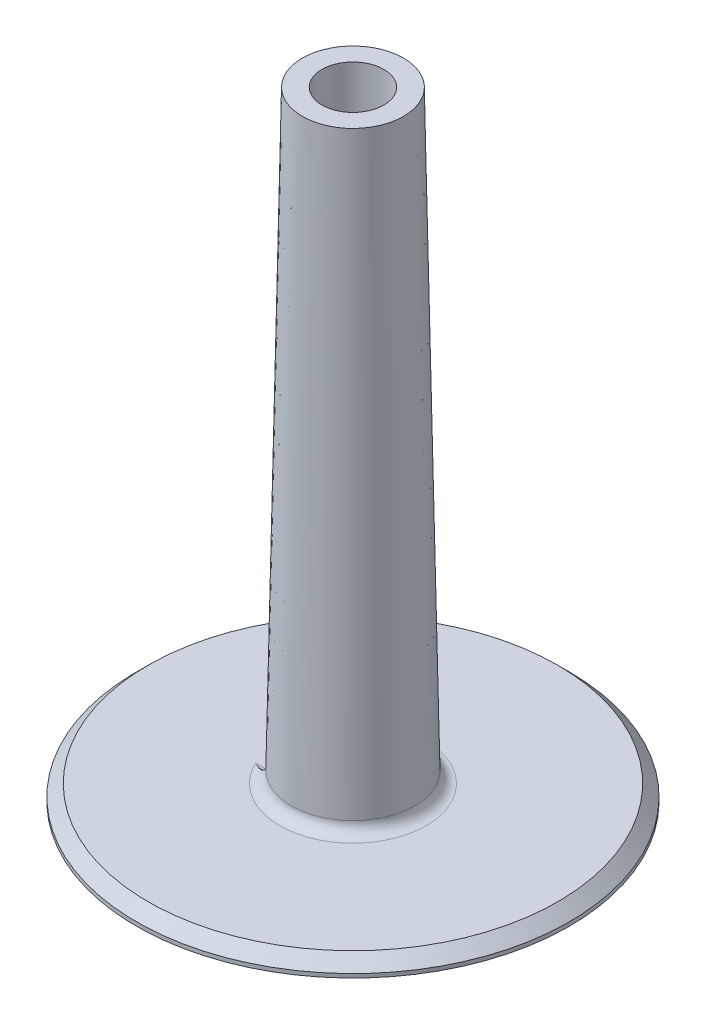
ISO-10303-21;
HEADER;
FILE_DESCRIPTION(('STEP AP214'),'2;1');
FILE_NAME('part.step','',(''),(''),'','','');
FILE_SCHEMA(('AUTOMOTIVE_DESIGN { 1 0 10303 214 1 1 1 1 }'));
ENDSEC;
DATA;
#1=APPLICATION_CONTEXT('core data for automotive mechanical design processes');
#2=APPLICATION_PROTOCOL_DEFINITION('international standard','automotive_design',2000,#1);
#3=PRODUCT_CONTEXT('',#1,'mechanical');
#4=PRODUCT('Part','Part','',(#3));
#5=PRODUCT_RELATED_PRODUCT_CATEGORY('part','',(#4));
#6=PRODUCT_DEFINITION_FORMATION('','',#4);
#7=PRODUCT_DEFINITION_CONTEXT('part definition',#1,'design');
#8=PRODUCT_DEFINITION('design','',#6,#7);
#9=PRODUCT_DEFINITION_SHAPE('','',#8);
#10=(LENGTH_UNIT() NAMED_UNIT(*) SI_UNIT(.MILLI.,.METRE.));
#11=(NAMED_UNIT(*) PLANE_ANGLE_UNIT() SI_UNIT($,.RADIAN.));
#12=(NAMED_UNIT(*) SI_UNIT($,.STERADIAN.) SOLID_ANGLE_UNIT());
#13=UNCERTAINTY_MEASURE_WITH_UNIT(LENGTH_MEASURE(1.E-05),#10,'distance_accuracy_value','');
#14=(GEOMETRIC_REPRESENTATION_CONTEXT(3) GLOBAL_UNCERTAINTY_ASSIGNED_CONTEXT((#13)) GLOBAL_UNIT_ASSIGNED_CONTEXT((#10,
#11,#12)) REPRESENTATION_CONTEXT('',''));
#15=CARTESIAN_POINT('',(0.,0.,0.));
#16=DIRECTION('',(0.,0.,1.));
#17=DIRECTION('',(1.,0.,0.));
#18=AXIS2_PLACEMENT_3D('',#15,#16,#17);
#19=CARTESIAN_POINT('',(0.,254.,0.));
#20=DIRECTION('',(0.,-1.,0.));
#21=DIRECTION('',(0.,0.,-1.));
#22=AXIS2_PLACEMENT_3D('',#19,#20,#21);
#23=CONICAL_SURFACE('',#22,7.9375,0.0187478031977445);
#24=CARTESIAN_POINT('',(0.,123.825,0.));
#25=DIRECTION('',(0.,-1.,0.));
#26=DIRECTION('',(0.,0.,-1.));
#27=AXIS2_PLACEMENT_3D('',#24,#25,#26);
#28=CIRCLE('',#27,10.37828125);
#29=CARTESIAN_POINT('',(0.,123.825,-10.37828125));
#30=VERTEX_POINT('',#29);
#31=EDGE_CURVE('E103',#30,#30,#28,.F.);
#32=ORIENTED_EDGE('',*,*,#31,.F.);
#33=EDGE_LOOP('',(#32));
#34=FACE_BOUND('',#33,.T.);
#35=CARTESIAN_POINT('',(-10.9986380954076,1.31233542988829E-08,6.3498));
#36=CARTESIAN_POINT('',(-10.9661542839363,1.8233393195671E-06,6.40607206991448));
#37=CARTESIAN_POINT('',(-10.9332096805369,0.00310269069035877,6.46201479725815));
#38=CARTESIAN_POINT('',(-10.8666748452448,0.0153468969863142,6.57284084258527));
#39=CARTESIAN_POINT('',(-10.8330846672008,0.0244897340620682,6.62772424817039));
#40=CARTESIAN_POINT('',(-10.7315971060793,0.0608037732642193,6.79044586185834));
#41=CARTESIAN_POINT('',(-10.6631335523318,0.0968591372913604,6.89609482020866));
#42=CARTESIAN_POINT('',(-10.5349289767664,0.18643584984036,7.08719809153657));
#43=CARTESIAN_POINT('',(-10.4750266462951,0.237726882466519,7.17360815162488));
#44=CARTESIAN_POINT('',(-10.3590417410145,0.357744114164864,7.33620002025002));
#45=CARTESIAN_POINT('',(-10.3029517020728,0.426434921148173,7.41240211697634));
#46=CARTESIAN_POINT('',(-10.2108354934768,0.56165114992968,7.53430871109204));
#47=CARTESIAN_POINT('',(-10.1732715971275,0.624537115578603,7.58290078618485));
#48=CARTESIAN_POINT('',(-10.1040072047982,0.759408570463965,7.67076859195739));
#49=CARTESIAN_POINT('',(-10.0722990805292,0.831382012606909,7.71005646230527));
#50=CARTESIAN_POINT('',(-10.0214488766076,0.970778224625026,7.77173685513282));
#51=CARTESIAN_POINT('',(-10.0010970258484,1.03699576980835,7.79584680184522));
#52=CARTESIAN_POINT('',(-9.9672621720457,1.17376969697781,7.83491118012799));
#53=CARTESIAN_POINT('',(-9.95377504044796,1.24432344241636,7.84987111575895));
#54=CARTESIAN_POINT('',(-9.93467318175553,1.38826201691278,7.86968760096606));
#55=CARTESIAN_POINT('',(-9.92909643153456,1.46165877691785,7.87449546508906));
#56=CARTESIAN_POINT('',(-9.92643180501236,1.60852621724321,7.87342379686221));
#57=CARTESIAN_POINT('',(-9.92934232422056,1.68199688096726,7.86754628462698));
#58=CARTESIAN_POINT('',(-9.94278697207492,1.82073908235096,7.84634684897258));
#59=CARTESIAN_POINT('',(-9.95269367573652,1.88619681619626,7.83181669384942));
#60=CARTESIAN_POINT('',(-9.97870464754827,2.01350027268655,7.79477109231769));
#61=CARTESIAN_POINT('',(-9.99481027634715,2.07534519889417,7.77225389285781));
#62=CARTESIAN_POINT('',(-10.0334166723422,2.19802223213817,7.71858747265611));
#63=CARTESIAN_POINT('',(-10.0562550585433,2.258547785773,7.68698559928534));
#64=CARTESIAN_POINT('',(-10.1065985965942,2.37345558209999,7.61709530115483));
#65=CARTESIAN_POINT('',(-10.1341058125403,2.42783508982519,7.5788039187332));
#66=CARTESIAN_POINT('',(-10.1978518813264,2.53909379207719,7.48934946494921));
#67=CARTESIAN_POINT('',(-10.234774460332,2.59471177563511,7.4371077353616));
#68=CARTESIAN_POINT('',(-10.3119965815803,2.69658731919294,7.32636341385606));
#69=CARTESIAN_POINT('',(-10.3522989149144,2.7428370328143,7.26785563599769));
#70=CARTESIAN_POINT('',(-10.4432901858431,2.83409361587009,7.13362319280051));
#71=CARTESIAN_POINT('',(-10.4944470406609,2.87701120879726,7.05679256274164));
#72=CARTESIAN_POINT('',(-10.5980846313508,2.94885649438555,6.89770137179443));
#73=CARTESIAN_POINT('',(-10.6505653896735,2.97778394963592,6.81544071878627));
#74=CARTESIAN_POINT('',(-10.7416690144113,3.01556466826313,6.66925237103833));
#75=CARTESIAN_POINT('',(-10.7803196545716,3.02769185550869,6.60616905803933));
#76=CARTESIAN_POINT('',(-10.8570140767606,3.04390338510256,6.47876710666235));
#77=CARTESIAN_POINT('',(-10.8950587864383,3.04800149483496,6.41445077414674));
#78=CARTESIAN_POINT('',(-10.9325978654994,3.04799998687663,6.3498));
#79=B_SPLINE_CURVE_WITH_KNOTS('',3,(#35,#36,#37,#38,#39,#40,#41,#42,#43,#44,#45,#46,#47,#48,#49,
#50,#51,#52,#53,#54,#55,#56,#57,#58,#59,#60,#61,#62,#63,#64,#65,#66,#67,#68,#69,#70,#71,#72,#73,
#74,#75,#76,#77,#78),.UNSPECIFIED.,.F.,.F.,(4,2,2,2,2,2,2,2,2,2,2,2,2,2,2,2,2,2,2,2,2,4),(0.,
0.19474624218606,0.389476310035777,0.779825918996431,1.12920632620116,1.47788170257181,
1.7406150269171,2.00300363747913,2.22214450305096,2.44115341753552,2.66121025173346,
2.8812254876024,3.08366918195934,3.28615733757051,3.50133963675868,3.71661731733759,
3.96999914654659,4.22359232568203,4.52778479726055,4.83198243076321,5.05646903045754,
5.28057036702371),.UNSPECIFIED.);
#80=CARTESIAN_POINT('',(-10.0900593872929,2.33538284217058,7.64005189175908));
#81=VERTEX_POINT('',#80);
#82=CARTESIAN_POINT('',(-10.9324817000762,3.048,6.35));
#83=VERTEX_POINT('',#82);
#84=EDGE_CURVE('E115',#81,#83,#79,.T.);
#85=ORIENTED_EDGE('',*,*,#84,.F.);
#86=CARTESIAN_POINT('',(0.,2.3353828421705,0.));
#87=DIRECTION('',(0.,1.,0.));
#88=DIRECTION('',(0.,0.,1.));
#89=AXIS2_PLACEMENT_3D('',#86,#87,#88);
#90=CIRCLE('',#89,12.6562115717093);
#91=CARTESIAN_POINT('',(-10.0900593872929,2.33538284217058,-7.64005189175908));
#92=VERTEX_POINT('',#91);
#93=EDGE_CURVE('E123',#81,#92,#90,.T.);
#94=ORIENTED_EDGE('',*,*,#93,.T.);
#95=CARTESIAN_POINT('',(-10.9325978654994,3.04799998687663,-6.3498));
#96=CARTESIAN_POINT('',(-10.8999979201371,3.04799780508361,-6.40593417678844));
#97=CARTESIAN_POINT('',(-10.8670360327973,3.0449123042439,-6.46179741861725));
#98=CARTESIAN_POINT('',(-10.8006542589209,3.03268977439008,-6.57259045315219));
#99=CARTESIAN_POINT('',(-10.7672343292529,3.02355217159326,-6.62752015684571));
#100=CARTESIAN_POINT('',(-10.6664357739375,2.98714087516176,-6.79072654074615));
#101=CARTESIAN_POINT('',(-10.5987755139002,2.9508703229383,-6.89697871548276));
#102=CARTESIAN_POINT('',(-10.4730979308032,2.86050085720492,-7.08918749483312));
#103=CARTESIAN_POINT('',(-10.4148273382496,2.80874517999183,-7.17609723820158));
#104=CARTESIAN_POINT('',(-10.302974296996,2.68735527570252,-7.33969690959744));
#105=CARTESIAN_POINT('',(-10.2493793656318,2.61777073472156,-7.41641435387412));
#106=CARTESIAN_POINT('',(-10.163955896329,2.48275537043931,-7.53708559341101));
#107=CARTESIAN_POINT('',(-10.1301872620934,2.42141146199877,-7.58425674264817));
#108=CARTESIAN_POINT('',(-10.0687004304121,2.29011021657658,-7.66975963828376));
#109=CARTESIAN_POINT('',(-10.0409748370741,2.22016357417996,-7.70810219300916));
#110=CARTESIAN_POINT('',(-9.99707248344839,2.08387342075445,-7.76909426221353));
#111=CARTESIAN_POINT('',(-9.97978845911007,2.01855662772188,-7.79323342323721));
#112=CARTESIAN_POINT('',(-9.9521679066627,1.88386625109741,-7.83255972654309));
#113=CARTESIAN_POINT('',(-9.94182740994984,1.8144950095339,-7.84775198185698));
#114=CARTESIAN_POINT('',(-9.92891257130494,1.67332364409966,-7.86834874614469));
#115=CARTESIAN_POINT('',(-9.92636660053408,1.60151560674109,-7.87371747016924));
#116=CARTESIAN_POINT('',(-9.92936949412806,1.45803311143739,-7.8742606509996));
#117=CARTESIAN_POINT('',(-9.93491826728178,1.38635865199622,-7.86943522267224));
#118=CARTESIAN_POINT('',(-9.95308210272741,1.24959843405244,-7.85058820690649));
#119=CARTESIAN_POINT('',(-9.96525892412575,1.18437393339872,-7.83712853802717));
#120=CARTESIAN_POINT('',(-9.99553457201065,1.05751939922595,-7.80234353069956));
#121=CARTESIAN_POINT('',(-10.0136349211939,0.995890294740902,-7.78101616960982));
#122=CARTESIAN_POINT('',(-10.056511386377,0.87217877915044,-7.72933923751777));
#123=CARTESIAN_POINT('',(-10.0817259859012,0.810508200796656,-7.69837414057168));
#124=CARTESIAN_POINT('',(-10.1366611808046,0.693363388835278,-7.62954736864455));
#125=CARTESIAN_POINT('',(-10.1663839489561,0.637892165602109,-7.59168236637951));
#126=CARTESIAN_POINT('',(-10.2351130907099,0.523695473751836,-7.5024579274402));
#127=CARTESIAN_POINT('',(-10.2748135193867,0.466325644177062,-7.44990013269533));
#128=CARTESIAN_POINT('',(-10.3573805605564,0.361177351411474,-7.33808862851842));
#129=CARTESIAN_POINT('',(-10.4002499596277,0.313407470359724,-7.27882900109429));
#130=CARTESIAN_POINT('',(-10.4965870141623,0.219142261434897,-7.14251880446839));
#131=CARTESIAN_POINT('',(-10.5504668950896,0.174789655795451,-7.06427382255195));
#132=CARTESIAN_POINT('',(-10.6591216929124,0.100598865606217,-6.90179473748161));
#133=CARTESIAN_POINT('',(-10.713896448689,0.0707580973815089,-6.81756170349842));
#134=CARTESIAN_POINT('',(-10.8074032347668,0.0324591710569328,-6.66932767287035));
#135=CARTESIAN_POINT('',(-10.8462883338145,0.0203396013859075,-6.60634745574944));
#136=CARTESIAN_POINT('',(-10.9232053159484,0.00411528454027798,-6.47898223081162));
#137=CARTESIAN_POINT('',(-10.961238354343,-1.05757921220453E-06,-6.41459939214499));
#138=CARTESIAN_POINT('',(-10.9986380954076,1.31233542561888E-08,-6.3498));
#139=B_SPLINE_CURVE_WITH_KNOTS('',3,(#95,#96,#97,#98,#99,#100,#101,#102,#103,#104,#105,#106,
#107,#108,#109,#110,#111,#112,#113,#114,#115,#116,#117,#118,#119,#120,#121,#122,#123,#124,#125,
#126,#127,#128,#129,#130,#131,#132,#133,#134,#135,#136,#137,#138),.UNSPECIFIED.,.F.,.F.,(4,2,2,
2,2,2,2,2,2,2,2,2,2,2,2,2,2,2,2,2,2,4),(0.,0.194566838668165,0.389152126310308,
0.779832459861628,1.12839981955684,1.47600614956844,1.72835909242503,1.98040143210367,
2.1947334460207,2.40894285302142,2.62393103571093,2.83891679594486,3.04116231330677,
3.24345986061007,3.4630551781796,3.68275667095821,3.94384758700948,4.20517088422039,
4.51846338558939,4.83170008819453,5.05628730426847,5.28054889889109),.UNSPECIFIED.);
#140=CARTESIAN_POINT('',(-10.9324817000762,3.04799999999999,-6.35));
#141=VERTEX_POINT('',#140);
#142=EDGE_CURVE('E148',#141,#92,#139,.T.);
#143=ORIENTED_EDGE('',*,*,#142,.F.);
#144=CARTESIAN_POINT('',(0.,3.048,0.));
#145=DIRECTION('',(0.,1.,0.));
#146=DIRECTION('',(0.,0.,1.));
#147=AXIS2_PLACEMENT_3D('',#144,#145,#146);
#148=CIRCLE('',#147,12.64285);
#149=EDGE_CURVE('E156',#83,#141,#148,.F.);
#150=ORIENTED_EDGE('',*,*,#149,.F.);
#151=EDGE_LOOP('',(#85,#94,#143,#150));
#152=FACE_BOUND('',#151,.T.);
#153=ADVANCED_FACE('F33',(#34,#152),#23,.T.);
#154=CARTESIAN_POINT('',(0.,-3.175,0.));
#155=DIRECTION('',(0.,-1.,0.));
#156=DIRECTION('',(0.,0.,-1.));
#157=AXIS2_PLACEMENT_3D('',#154,#155,#156);
#158=PLANE('',#157);
#159=CARTESIAN_POINT('',(0.,-3.175,0.));
#160=DIRECTION('',(0.,-1.,0.));
#161=DIRECTION('',(0.,0.,-1.));
#162=AXIS2_PLACEMENT_3D('',#159,#160,#161);
#163=CIRCLE('',#162,44.45);
#164=CARTESIAN_POINT('',(0.,-3.175,-44.45));
#165=VERTEX_POINT('',#164);
#166=EDGE_CURVE('E110',#165,#165,#163,.T.);
#167=ORIENTED_EDGE('',*,*,#166,.T.);
#168=EDGE_LOOP('',(#167));
#169=FACE_BOUND('',#168,.T.);
#170=ADVANCED_FACE('F161',(#169),#158,.T.);
#171=CARTESIAN_POINT('',(0.,-3.175,0.));
#172=DIRECTION('',(0.,1.,0.));
#173=DIRECTION('',(0.,0.,1.));
#174=AXIS2_PLACEMENT_3D('',#171,#172,#173);
#175=CYLINDRICAL_SURFACE('',#174,44.45);
#176=CARTESIAN_POINT('',(0.,-2.38000000000001,0.));
#177=DIRECTION('',(0.,-1.,0.));
#178=DIRECTION('',(0.,0.,-1.));
#179=AXIS2_PLACEMENT_3D('',#176,#177,#178);
#180=CIRCLE('',#179,44.45);
#181=CARTESIAN_POINT('',(0.,-2.38000000000002,-44.45));
#182=VERTEX_POINT('',#181);
#183=EDGE_CURVE('E109',#182,#182,#180,.T.);
#184=ORIENTED_EDGE('',*,*,#183,.T.);
#185=EDGE_LOOP('',(#184));
#186=FACE_BOUND('',#185,.T.);
#187=ORIENTED_EDGE('',*,*,#166,.F.);
#188=EDGE_LOOP('',(#187));
#189=FACE_BOUND('',#188,.T.);
#190=ADVANCED_FACE('F215',(#186,#189),#175,.T.);
#191=CARTESIAN_POINT('',(0.,-2.38000000000001,0.));
#192=DIRECTION('',(0.,-1.,0.));
#193=DIRECTION('',(0.,0.,-1.));
#194=AXIS2_PLACEMENT_3D('',#191,#192,#193);
#195=CONICAL_SURFACE('',#194,44.45,0.785398163397451);
#196=CARTESIAN_POINT('',(0.,0.,0.));
#197=DIRECTION('',(0.,-1.,0.));
#198=DIRECTION('',(0.,0.,-1.));
#199=AXIS2_PLACEMENT_3D('',#196,#197,#198);
#200=CIRCLE('',#199,42.07);
#201=CARTESIAN_POINT('',(0.,0.,-42.07));
#202=VERTEX_POINT('',#201);
#203=EDGE_CURVE('E97',#202,#202,#200,.F.);
#204=ORIENTED_EDGE('',*,*,#203,.F.);
#205=EDGE_LOOP('',(#204));
#206=FACE_BOUND('',#205,.T.);
#207=ORIENTED_EDGE('',*,*,#183,.F.);
#208=EDGE_LOOP('',(#207));
#209=FACE_BOUND('',#208,.T.);
#210=ADVANCED_FACE('F164',(#206,#209),#195,.T.);
#211=CARTESIAN_POINT('',(0.,0.,0.));
#212=DIRECTION('',(0.,-1.,0.));
#213=DIRECTION('',(0.,0.,-1.));
#214=AXIS2_PLACEMENT_3D('',#211,#212,#213);
#215=PLANE('',#214);
#216=DIRECTION('',(1.,0.,0.));
#217=VECTOR('',#216,1.);
#218=CARTESIAN_POINT('',(-16.51,0.,-6.35));
#219=LINE('',#218,#217);
#220=CARTESIAN_POINT('',(-13.6291078519576,0.,-6.35));
#221=VERTEX_POINT('',#220);
#222=CARTESIAN_POINT('',(0.,0.,-6.35));
#223=VERTEX_POINT('',#222);
#224=EDGE_CURVE('E50',#221,#223,#219,.T.);
#225=ORIENTED_EDGE('',*,*,#224,.F.);
#226=CARTESIAN_POINT('',(0.,0.,0.));
#227=DIRECTION('',(0.,-1.,0.));
#228=DIRECTION('',(0.,0.,-1.));
#229=AXIS2_PLACEMENT_3D('',#226,#227,#228);
#230=CIRCLE('',#229,15.0357933226116);
#231=CARTESIAN_POINT('',(-13.6291078519576,0.,6.35));
#232=VERTEX_POINT('',#231);
#233=EDGE_CURVE('E84',#221,#232,#230,.T.);
#234=ORIENTED_EDGE('',*,*,#233,.T.);
#235=DIRECTION('',(1.,0.,0.));
#236=VECTOR('',#235,1.);
#237=CARTESIAN_POINT('',(-16.51,0.,6.35));
#238=LINE('',#237,#236);
#239=CARTESIAN_POINT('',(0.,0.,6.35));
#240=VERTEX_POINT('',#239);
#241=EDGE_CURVE('E57',#232,#240,#238,.T.);
#242=ORIENTED_EDGE('',*,*,#241,.T.);
#243=CARTESIAN_POINT('',(0.,0.,0.));
#244=DIRECTION('',(0.,1.,0.));
#245=DIRECTION('',(0.,0.,1.));
#246=AXIS2_PLACEMENT_3D('',#243,#244,#245);
#247=CIRCLE('',#246,6.35);
#248=EDGE_CURVE('E82',#240,#223,#247,.T.);
#249=ORIENTED_EDGE('',*,*,#248,.T.);
#250=EDGE_LOOP('',(#225,#234,#242,#249));
#251=FACE_BOUND('',#250,.T.);
#252=ORIENTED_EDGE('',*,*,#203,.T.);
#253=EDGE_LOOP('',(#252));
#254=FACE_BOUND('',#253,.T.);
#255=ADVANCED_FACE('F79',(#251,#254),#215,.F.);
#256=CARTESIAN_POINT('',(0.,0.,0.));
#257=DIRECTION('',(0.,1.,0.));
#258=DIRECTION('',(0.,0.,1.));
#259=AXIS2_PLACEMENT_3D('',#256,#257,#258);
#260=CYLINDRICAL_SURFACE('',#259,6.35);
#261=CARTESIAN_POINT('',(0.,123.825,0.));
#262=DIRECTION('',(0.,-1.,0.));
#263=DIRECTION('',(0.,0.,-1.));
#264=AXIS2_PLACEMENT_3D('',#261,#262,#263);
#265=CIRCLE('',#264,6.35);
#266=CARTESIAN_POINT('',(0.,123.825,-6.34999999999999));
#267=VERTEX_POINT('',#266);
#268=EDGE_CURVE('E38',#267,#267,#265,.F.);
#269=ORIENTED_EDGE('',*,*,#268,.T.);
#270=EDGE_LOOP('',(#269));
#271=FACE_BOUND('',#270,.T.);
#272=CARTESIAN_POINT('',(0.,3.04799999999999,0.));
#273=DIRECTION('',(0.,1.,0.));
#274=DIRECTION('',(0.,0.,1.));
#275=AXIS2_PLACEMENT_3D('',#272,#273,#274);
#276=CIRCLE('',#275,6.35);
#277=CARTESIAN_POINT('',(0.,3.04799999999999,6.35000000000001));
#278=VERTEX_POINT('',#277);
#279=CARTESIAN_POINT('',(0.,3.04799999999999,-6.35));
#280=VERTEX_POINT('',#279);
#281=EDGE_CURVE('E96',#278,#280,#276,.F.);
#282=ORIENTED_EDGE('',*,*,#281,.T.);
#283=DIRECTION('',(0.,1.,0.));
#284=VECTOR('',#283,1.);
#285=CARTESIAN_POINT('',(0.,0.,-6.34999999999999));
#286=LINE('',#285,#284);
#287=EDGE_CURVE('E108',#280,#223,#286,.F.);
#288=ORIENTED_EDGE('',*,*,#287,.T.);
#289=ORIENTED_EDGE('',*,*,#248,.F.);
#290=DIRECTION('',(0.,1.,0.));
#291=VECTOR('',#290,1.);
#292=CARTESIAN_POINT('',(0.,0.,6.35000000000001));
#293=LINE('',#292,#291);
#294=EDGE_CURVE('E90',#240,#278,#293,.T.);
#295=ORIENTED_EDGE('',*,*,#294,.T.);
#296=EDGE_LOOP('',(#282,#288,#289,#295));
#297=FACE_BOUND('',#296,.T.);
#298=ADVANCED_FACE('F106',(#271,#297),#260,.F.);
#299=CARTESIAN_POINT('',(-16.51,3.04799999999999,6.35));
#300=DIRECTION('',(0.,1.,0.));
#301=DIRECTION('',(0.,0.,1.));
#302=AXIS2_PLACEMENT_3D('',#299,#300,#301);
#303=PLANE('',#302);
#304=ORIENTED_EDGE('',*,*,#149,.T.);
#305=DIRECTION('',(1.,0.,0.));
#306=VECTOR('',#305,1.);
#307=CARTESIAN_POINT('',(-16.51,3.04799999999999,-6.35));
#308=LINE('',#307,#306);
#309=EDGE_CURVE('E174',#141,#280,#308,.T.);
#310=ORIENTED_EDGE('',*,*,#309,.T.);
#311=ORIENTED_EDGE('',*,*,#281,.F.);
#312=DIRECTION('',(1.,0.,0.));
#313=VECTOR('',#312,1.);
#314=CARTESIAN_POINT('',(-16.51,3.04799999999999,6.35));
#315=LINE('',#314,#313);
#316=EDGE_CURVE('E101',#83,#278,#315,.T.);
#317=ORIENTED_EDGE('',*,*,#316,.F.);
#318=EDGE_LOOP('',(#304,#310,#311,#317));
#319=FACE_BOUND('',#318,.T.);
#320=ADVANCED_FACE('F142',(#319),#303,.F.);
#321=CARTESIAN_POINT('',(0.,1.52399999999999,6.35));
#322=DIRECTION('',(1.,0.,0.));
#323=DIRECTION('',(0.,0.,-1.));
#324=AXIS2_PLACEMENT_3D('',#321,#322,#323);
#325=PLANE('',#324);
#326=CARTESIAN_POINT('',(0.,1.52399999999999,-6.35));
#327=DIRECTION('',(1.,0.,0.));
#328=DIRECTION('',(0.,0.,-1.));
#329=AXIS2_PLACEMENT_3D('',#326,#327,#328);
#330=CIRCLE('',#329,1.524);
#331=EDGE_CURVE('E86',#223,#280,#330,.T.);
#332=ORIENTED_EDGE('',*,*,#331,.F.);
#333=ORIENTED_EDGE('',*,*,#287,.F.);
#334=EDGE_LOOP('',(#332,#333));
#335=FACE_BOUND('',#334,.T.);
#336=ADVANCED_FACE('F183',(#335),#325,.F.);
#337=CARTESIAN_POINT('',(0.,1.52399999999999,6.35));
#338=DIRECTION('',(1.,0.,0.));
#339=DIRECTION('',(0.,0.,-1.));
#340=AXIS2_PLACEMENT_3D('',#337,#338,#339);
#341=CIRCLE('',#340,1.524);
#342=EDGE_CURVE('E92',#278,#240,#341,.T.);
#343=ORIENTED_EDGE('',*,*,#342,.F.);
#344=ORIENTED_EDGE('',*,*,#294,.F.);
#345=EDGE_LOOP('',(#343,#344));
#346=FACE_BOUND('',#345,.T.);
#347=ADVANCED_FACE('F91',(#346),#325,.F.);
#348=CARTESIAN_POINT('',(-16.51,1.52399999999999,6.35));
#349=DIRECTION('',(1.,0.,0.));
#350=DIRECTION('',(0.,0.,-1.));
#351=AXIS2_PLACEMENT_3D('',#348,#349,#350);
#352=CYLINDRICAL_SURFACE('',#351,1.524);
#353=ORIENTED_EDGE('',*,*,#241,.F.);
#354=CARTESIAN_POINT('',(-10.0900593872929,2.33538284217058,7.64005189175908));
#355=CARTESIAN_POINT('',(-10.0720602804357,2.29572742165215,7.66503896221443));
#356=CARTESIAN_POINT('',(-10.0562530889686,2.254000315731,7.68868304057025));
#357=CARTESIAN_POINT('',(-10.0303546389345,2.16684633055324,7.73263939915232));
#358=CARTESIAN_POINT('',(-10.0202984851309,2.12139862485054,7.75293069038195));
#359=CARTESIAN_POINT('',(-10.0074390312704,2.02739905708821,7.78934807411145));
#360=CARTESIAN_POINT('',(-10.0046895667632,1.97882684000557,7.80544246597517));
#361=CARTESIAN_POINT('',(-10.007517194515,1.88069509465623,7.8325391902321));
#362=CARTESIAN_POINT('',(-10.0130629911556,1.83113996971219,7.8435604571741));
#363=CARTESIAN_POINT('',(-10.0313127336407,1.73762446623146,7.85962633968218));
#364=CARTESIAN_POINT('',(-10.0432576806389,1.69359385920215,7.86515277710417));
#365=CARTESIAN_POINT('',(-10.0729639897776,1.6071700954112,7.87234856439746));
#366=CARTESIAN_POINT('',(-10.0907359423986,1.564780078414,7.8740108463966));
#367=CARTESIAN_POINT('',(-10.1403908345534,1.46324736900526,7.8739839735773));
#368=CARTESIAN_POINT('',(-10.1749961281119,1.40544750627178,7.87038410941652));
#369=CARTESIAN_POINT('',(-10.2513081503038,1.29542253634189,7.85778445733436));
#370=CARTESIAN_POINT('',(-10.2930312980392,1.24321078317415,7.84877206010692));
#371=CARTESIAN_POINT('',(-10.3753906835681,1.15067382926394,7.82822044612942));
#372=CARTESIAN_POINT('',(-10.4154287382914,1.10969224041141,7.81717902648637));
#373=CARTESIAN_POINT('',(-10.4981728306374,1.03125661034391,7.792728568454));
#374=CARTESIAN_POINT('',(-10.5408809192753,0.993805337758593,7.77931769513836));
#375=CARTESIAN_POINT('',(-10.6720793968919,0.886036784962199,7.73621829448046));
#376=CARTESIAN_POINT('',(-10.7635150150513,0.82044148881619,7.70369732214776));
#377=CARTESIAN_POINT('',(-10.9517619157138,0.698768309005792,7.6331766984595));
#378=CARTESIAN_POINT('',(-11.0486188802185,0.642795454358483,7.5951240488696));
#379=CARTESIAN_POINT('',(-11.2452891410575,0.539362616524295,7.51504978054109));
#380=CARTESIAN_POINT('',(-11.3451052325073,0.491911001447637,7.47302432152286));
#381=CARTESIAN_POINT('',(-11.5467446810817,0.404383584107873,7.38578734410734));
#382=CARTESIAN_POINT('',(-11.6485710050895,0.364319752752304,7.34057081609132));
#383=CARTESIAN_POINT('',(-11.8534633555565,0.290915294424784,7.24754461521997));
#384=CARTESIAN_POINT('',(-11.9565296396434,0.257576091121044,7.19973439596833));
#385=CARTESIAN_POINT('',(-12.1891454201394,0.189661358691503,7.08977592089116));
#386=CARTESIAN_POINT('',(-12.3189163886739,0.156834292727333,7.02701515933704));
#387=CARTESIAN_POINT('',(-12.5791102049355,0.100460163744359,6.89865468538222));
#388=CARTESIAN_POINT('',(-12.7095332647812,0.0769163503905098,6.83305398774518));
#389=CARTESIAN_POINT('',(-12.970185749837,0.0390506201098956,6.6997042875943));
#390=CARTESIAN_POINT('',(-13.1004148227325,0.0247053789568853,6.63196117932103));
#391=CARTESIAN_POINT('',(-13.3605549825459,0.00530017492145727,6.49466925377887));
#392=CARTESIAN_POINT('',(-13.4904662026489,0.000235230987990854,6.42512142550672));
#393=CARTESIAN_POINT('',(-13.6230332320899,2.67332205513943E-06,6.35329279100805));
#394=CARTESIAN_POINT('',(-13.6260706486791,5.07636985549978E-09,6.35164656825797));
#395=CARTESIAN_POINT('',(-13.6291078519576,0.,6.35));
#396=B_SPLINE_CURVE_WITH_KNOTS('',3,(#354,#355,#356,#357,#358,#359,#360,#361,#362,#363,#364,
#365,#366,#367,#368,#369,#370,#371,#372,#373,#374,#375,#376,#377,#378,#379,#380,#381,#382,#383,
#384,#385,#386,#387,#388,#389,#390,#391,#392,#393,#394,#395),.UNSPECIFIED.,.F.,.F.,(4,2,2,2,2,2,
2,2,2,2,2,2,2,2,2,2,2,2,2,2,4),(0.,0.150800775459035,0.302512486072246,0.455338945990164,
0.607590288325,0.74484276159701,0.882346084567962,1.08358800415086,1.28530057545945,
1.46009083609404,1.63501705396371,1.98543677847842,2.33946713716988,2.69384328526843,
3.04878870094931,3.4038091832852,3.84698089518663,4.29030760488665,4.73250570747291,
5.17446639769849,5.18483092889774),.UNSPECIFIED.);
#397=EDGE_CURVE('E11',#232,#81,#396,.F.);
#398=ORIENTED_EDGE('',*,*,#397,.T.);
#399=ORIENTED_EDGE('',*,*,#84,.T.);
#400=ORIENTED_EDGE('',*,*,#316,.T.);
#401=ORIENTED_EDGE('',*,*,#342,.T.);
#402=EDGE_LOOP('',(#353,#398,#399,#400,#401));
#403=FACE_BOUND('',#402,.T.);
#404=ADVANCED_FACE('F99',(#403),#352,.F.);
#405=CARTESIAN_POINT('',(-16.51,1.52399999999999,-6.35));
#406=DIRECTION('',(1.,0.,0.));
#407=DIRECTION('',(0.,0.,-1.));
#408=AXIS2_PLACEMENT_3D('',#405,#406,#407);
#409=CYLINDRICAL_SURFACE('',#408,1.524);
#410=ORIENTED_EDGE('',*,*,#142,.T.);
#411=CARTESIAN_POINT('',(-10.0900593872929,2.33538284217057,-7.64005189175907));
#412=CARTESIAN_POINT('',(-10.0720602804357,2.29572742165215,-7.66503896221443));
#413=CARTESIAN_POINT('',(-10.0562530889686,2.254000315731,-7.68868304057025));
#414=CARTESIAN_POINT('',(-10.0303546389345,2.16684633055324,-7.73263939915232));
#415=CARTESIAN_POINT('',(-10.0202984851309,2.12139862485054,-7.75293069038195));
#416=CARTESIAN_POINT('',(-10.0074390312704,2.02739905708822,-7.78934807411145));
#417=CARTESIAN_POINT('',(-10.0046895667632,1.97882684000557,-7.80544246597517));
#418=CARTESIAN_POINT('',(-10.007517194515,1.88069509465623,-7.8325391902321));
#419=CARTESIAN_POINT('',(-10.0130629911556,1.83113996971219,-7.8435604571741));
#420=CARTESIAN_POINT('',(-10.0313127336407,1.73762446623146,-7.85962633968218));
#421=CARTESIAN_POINT('',(-10.0432576806389,1.69359385920215,-7.86515277710417));
#422=CARTESIAN_POINT('',(-10.0729639897776,1.6071700954112,-7.87234856439746));
#423=CARTESIAN_POINT('',(-10.0907359423986,1.564780078414,-7.8740108463966));
#424=CARTESIAN_POINT('',(-10.1403908345534,1.46324736900526,-7.8739839735773));
#425=CARTESIAN_POINT('',(-10.1749961281119,1.40544750627178,-7.87038410941652));
#426=CARTESIAN_POINT('',(-10.2513081503038,1.29542253634189,-7.85778445733436));
#427=CARTESIAN_POINT('',(-10.2930312980392,1.24321078317415,-7.84877206010692));
#428=CARTESIAN_POINT('',(-10.3753906835681,1.15067382926394,-7.82822044612942));
#429=CARTESIAN_POINT('',(-10.4154287382914,1.10969224041141,-7.81717902648637));
#430=CARTESIAN_POINT('',(-10.4981728306374,1.03125661034391,-7.792728568454));
#431=CARTESIAN_POINT('',(-10.5408809192753,0.993805337758593,-7.77931769513836));
#432=CARTESIAN_POINT('',(-10.6720793968919,0.886036784962198,-7.73621829448046));
#433=CARTESIAN_POINT('',(-10.7635150150513,0.820441488816188,-7.70369732214776));
#434=CARTESIAN_POINT('',(-10.9517619157138,0.698768309005789,-7.6331766984595));
#435=CARTESIAN_POINT('',(-11.0486188802185,0.642795454358479,-7.59512404886959));
#436=CARTESIAN_POINT('',(-11.2452891410575,0.53936261652429,-7.51504978054109));
#437=CARTESIAN_POINT('',(-11.3451052325074,0.491911001447632,-7.47302432152285));
#438=CARTESIAN_POINT('',(-11.5467446810817,0.404383584107867,-7.38578734410734));
#439=CARTESIAN_POINT('',(-11.6485710050895,0.364319752752299,-7.34057081609132));
#440=CARTESIAN_POINT('',(-11.8534633555565,0.290915294424781,-7.24754461521997));
#441=CARTESIAN_POINT('',(-11.9565296396434,0.257576091121042,-7.19973439596833));
#442=CARTESIAN_POINT('',(-12.1891454201394,0.189661358691501,-7.08977592089115));
#443=CARTESIAN_POINT('',(-12.318916388674,0.156834292727332,-7.02701515933705));
#444=CARTESIAN_POINT('',(-12.5791102049355,0.100460163744359,-6.89865468538222));
#445=CARTESIAN_POINT('',(-12.7095332647811,0.0769163503905103,-6.83305398774516));
#446=CARTESIAN_POINT('',(-12.970185749837,0.0390506201098961,-6.69970428759432));
#447=CARTESIAN_POINT('',(-13.1004148227325,0.0247053789568854,-6.6319611793211));
#448=CARTESIAN_POINT('',(-13.3605549825459,0.00530017492145767,-6.4946692537788));
#449=CARTESIAN_POINT('',(-13.4904662026488,0.000235230987992164,-6.42512142550646));
#450=CARTESIAN_POINT('',(-13.6230332320898,2.67332205511193E-06,-6.35329279100804));
#451=CARTESIAN_POINT('',(-13.6260706486791,5.07636979608465E-09,-6.35164656825796));
#452=CARTESIAN_POINT('',(-13.6291078519576,0.,-6.35));
#453=B_SPLINE_CURVE_WITH_KNOTS('',3,(#411,#412,#413,#414,#415,#416,#417,#418,#419,#420,#421,
#422,#423,#424,#425,#426,#427,#428,#429,#430,#431,#432,#433,#434,#435,#436,#437,#438,#439,#440,
#441,#442,#443,#444,#445,#446,#447,#448,#449,#450,#451,#452),.UNSPECIFIED.,.F.,.F.,(4,2,2,2,2,2,
2,2,2,2,2,2,2,2,2,2,2,2,2,2,4),(0.,0.150800775459036,0.302512486072246,0.455338945990165,
0.607590288325002,0.744842761597012,0.882346084567964,1.08358800415086,1.28530057545946,
1.46009083609405,1.63501705396371,1.98543677847842,2.33946713716989,2.69384328526845,
3.04878870094933,3.40380918328522,3.84698089518664,4.29030760488664,4.7325057074729,
5.17446639769849,5.18483092889774),.UNSPECIFIED.);
#454=EDGE_CURVE('E43',#92,#221,#453,.T.);
#455=ORIENTED_EDGE('',*,*,#454,.T.);
#456=ORIENTED_EDGE('',*,*,#224,.T.);
#457=ORIENTED_EDGE('',*,*,#331,.T.);
#458=ORIENTED_EDGE('',*,*,#309,.F.);
#459=EDGE_LOOP('',(#410,#455,#456,#457,#458));
#460=FACE_BOUND('',#459,.T.);
#461=ADVANCED_FACE('F137',(#460),#409,.F.);
#462=CARTESIAN_POINT('',(0.,2.37999999999999,0.));
#463=DIRECTION('',(0.,-1.,0.));
#464=DIRECTION('',(0.,0.,-1.));
#465=AXIS2_PLACEMENT_3D('',#462,#463,#464);
#466=TOROIDAL_SURFACE('',#465,15.0357933226116,2.38);
#467=ORIENTED_EDGE('',*,*,#397,.F.);
#468=ORIENTED_EDGE('',*,*,#233,.F.);
#469=ORIENTED_EDGE('',*,*,#454,.F.);
#470=ORIENTED_EDGE('',*,*,#93,.F.);
#471=EDGE_LOOP('',(#467,#468,#469,#470));
#472=FACE_BOUND('',#471,.T.);
#473=ADVANCED_FACE('F35',(#472),#466,.F.);
#474=CARTESIAN_POINT('',(-53.2004793707814,123.825,-38.1));
#475=DIRECTION('',(0.,-1.,0.));
#476=DIRECTION('',(0.,0.,-1.));
#477=AXIS2_PLACEMENT_3D('',#474,#475,#476);
#478=PLANE('',#477);
#479=ORIENTED_EDGE('',*,*,#31,.T.);
#480=EDGE_LOOP('',(#479));
#481=FACE_BOUND('',#480,.T.);
#482=ORIENTED_EDGE('',*,*,#268,.F.);
#483=EDGE_LOOP('',(#482));
#484=FACE_BOUND('',#483,.T.);
#485=ADVANCED_FACE('F194',(#481,#484),#478,.F.);
#486=CLOSED_SHELL('',(#153,#170,#190,#210,#255,#298,#320,#336,#347,#404,#461,#473,#485));
#487=MANIFOLD_SOLID_BREP('B2',#486);
#488=ADVANCED_BREP_SHAPE_REPRESENTATION('',(#18,#487),#14);
#489=SHAPE_DEFINITION_REPRESENTATION(#9,#488);
ENDSEC;
END-ISO-10303-21;
